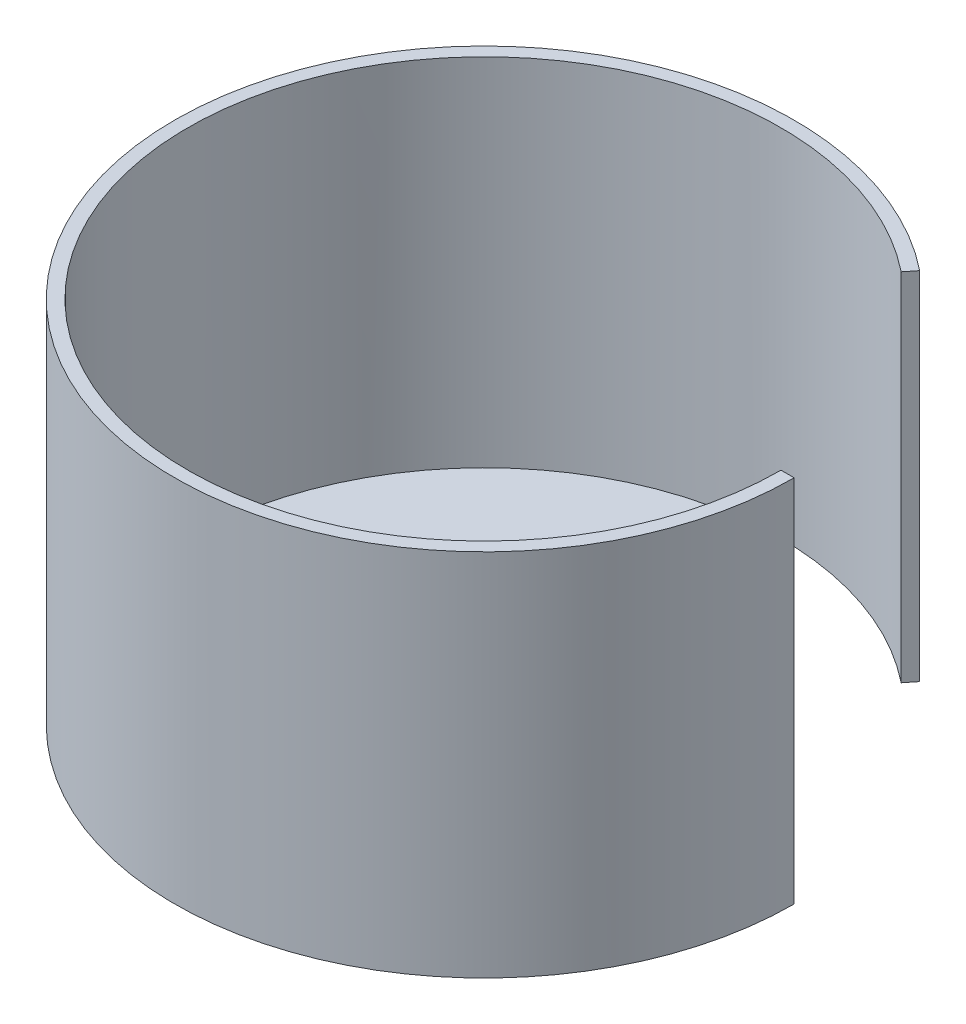
ISO-10303-21;
HEADER;
FILE_DESCRIPTION(('STEP AP214'),'2;1');
FILE_NAME('part.step','',(''),(''),'','','');
FILE_SCHEMA(('AUTOMOTIVE_DESIGN { 1 0 10303 214 1 1 1 1 }'));
ENDSEC;
DATA;
#1=APPLICATION_CONTEXT('core data for automotive mechanical design processes');
#2=APPLICATION_PROTOCOL_DEFINITION('international standard','automotive_design',2000,#1);
#3=PRODUCT_CONTEXT('',#1,'mechanical');
#4=PRODUCT('Part','Part','',(#3));
#5=PRODUCT_RELATED_PRODUCT_CATEGORY('part','',(#4));
#6=PRODUCT_DEFINITION_FORMATION('','',#4);
#7=PRODUCT_DEFINITION_CONTEXT('part definition',#1,'design');
#8=PRODUCT_DEFINITION('design','',#6,#7);
#9=PRODUCT_DEFINITION_SHAPE('','',#8);
#10=(LENGTH_UNIT() NAMED_UNIT(*) SI_UNIT(.MILLI.,.METRE.));
#11=(NAMED_UNIT(*) PLANE_ANGLE_UNIT() SI_UNIT($,.RADIAN.));
#12=(NAMED_UNIT(*) SI_UNIT($,.STERADIAN.) SOLID_ANGLE_UNIT());
#13=UNCERTAINTY_MEASURE_WITH_UNIT(LENGTH_MEASURE(1.E-05),#10,'distance_accuracy_value','');
#14=(GEOMETRIC_REPRESENTATION_CONTEXT(3) GLOBAL_UNCERTAINTY_ASSIGNED_CONTEXT((#13)) GLOBAL_UNIT_ASSIGNED_CONTEXT((#10,
#11,#12)) REPRESENTATION_CONTEXT('',''));
#15=CARTESIAN_POINT('',(0.,0.,0.));
#16=DIRECTION('',(0.,0.,1.));
#17=DIRECTION('',(1.,0.,0.));
#18=AXIS2_PLACEMENT_3D('',#15,#16,#17);
#19=CARTESIAN_POINT('',(0.,2.,0.));
#20=DIRECTION('',(0.,1.,0.));
#21=DIRECTION('',(0.,0.,1.));
#22=AXIS2_PLACEMENT_3D('',#19,#20,#21);
#23=PLANE('',#22);
#24=CARTESIAN_POINT('',(0.,2.,0.));
#25=DIRECTION('',(0.,-1.,0.));
#26=DIRECTION('',(0.,0.,1.));
#27=AXIS2_PLACEMENT_3D('',#24,#25,#26);
#28=CIRCLE('',#27,45.);
#29=CARTESIAN_POINT('',(42.6905850844787,2.,14.2307394447684));
#30=VERTEX_POINT('',#29);
#31=CARTESIAN_POINT('',(-10.0134420280343,2.,-43.871756048182));
#32=VERTEX_POINT('',#31);
#33=EDGE_CURVE('E163',#30,#32,#28,.T.);
#34=ORIENTED_EDGE('',*,*,#33,.F.);
#35=DIRECTION('',(-1.,0.,0.));
#36=VECTOR('',#35,1.);
#37=CARTESIAN_POINT('',(15.,2.,14.2307394447684));
#38=LINE('',#37,#36);
#39=CARTESIAN_POINT('',(4.74194631508132,2.,14.2307394447684));
#40=VERTEX_POINT('',#39);
#41=EDGE_CURVE('E150',#30,#40,#38,.T.);
#42=ORIENTED_EDGE('',*,*,#41,.T.);
#43=CARTESIAN_POINT('',(0.,2.,0.));
#44=DIRECTION('',(0.,1.,0.));
#45=DIRECTION('',(0.,0.,1.));
#46=AXIS2_PLACEMENT_3D('',#43,#44,#45);
#47=CIRCLE('',#46,15.);
#48=CARTESIAN_POINT('',(-3.33781400934477,2.,-14.6239186827273));
#49=VERTEX_POINT('',#48);
#50=EDGE_CURVE('E55',#40,#49,#47,.T.);
#51=ORIENTED_EDGE('',*,*,#50,.T.);
#52=DIRECTION('',(-0.222520933956318,0.,-0.974927912181823));
#53=VECTOR('',#52,1.);
#54=CARTESIAN_POINT('',(-3.33781400934477,2.,-14.6239186827273));
#55=LINE('',#54,#53);
#56=EDGE_CURVE('E132',#49,#32,#55,.T.);
#57=ORIENTED_EDGE('',*,*,#56,.T.);
#58=EDGE_LOOP('',(#34,#42,#51,#57));
#59=FACE_BOUND('',#58,.T.);
#60=ADVANCED_FACE('F33',(#59),#23,.T.);
#61=CARTESIAN_POINT('',(0.,2.,0.));
#62=DIRECTION('',(0.,-1.,0.));
#63=DIRECTION('',(0.,0.,-1.));
#64=AXIS2_PLACEMENT_3D('',#61,#62,#63);
#65=CYLINDRICAL_SURFACE('',#64,15.);
#66=CARTESIAN_POINT('',(0.,0.,0.));
#67=DIRECTION('',(0.,1.,0.));
#68=DIRECTION('',(0.,0.,1.));
#69=AXIS2_PLACEMENT_3D('',#66,#67,#68);
#70=CIRCLE('',#69,15.);
#71=CARTESIAN_POINT('',(15.,0.,0.));
#72=VERTEX_POINT('',#71);
#73=CARTESIAN_POINT('',(-3.33781400934477,0.,-14.6239186827273));
#74=VERTEX_POINT('',#73);
#75=EDGE_CURVE('E121',#72,#74,#70,.T.);
#76=ORIENTED_EDGE('',*,*,#75,.T.);
#77=DIRECTION('',(0.,-1.,0.));
#78=VECTOR('',#77,1.);
#79=CARTESIAN_POINT('',(-3.33781400934477,2.,-14.6239186827273));
#80=LINE('',#79,#78);
#81=EDGE_CURVE('E147',#49,#74,#80,.T.);
#82=ORIENTED_EDGE('',*,*,#81,.F.);
#83=ORIENTED_EDGE('',*,*,#50,.F.);
#84=CARTESIAN_POINT('',(0.,0.,0.));
#85=DIRECTION('',(0.,0.99026806874157,-0.139173100960066));
#86=DIRECTION('',(0.,-0.139173100960066,-0.99026806874157));
#87=AXIS2_PLACEMENT_3D('',#84,#85,#86);
#88=ELLIPSE('',#87,15.1474135877793,15.);
#89=EDGE_CURVE('E41',#40,#72,#88,.T.);
#90=ORIENTED_EDGE('',*,*,#89,.T.);
#91=EDGE_LOOP('',(#76,#82,#83,#90));
#92=FACE_BOUND('',#91,.T.);
#93=ADVANCED_FACE('F153',(#92),#65,.T.);
#94=CARTESIAN_POINT('',(-3.33781400934477,2.,-14.6239186827273));
#95=DIRECTION('',(-0.974927912181823,0.,0.222520933956318));
#96=DIRECTION('',(0.222520933956318,0.,0.974927912181823));
#97=AXIS2_PLACEMENT_3D('',#94,#95,#96);
#98=PLANE('',#97);
#99=DIRECTION('',(-0.222520933956318,0.,-0.974927912181823));
#100=VECTOR('',#99,1.);
#101=CARTESIAN_POINT('',(-3.33781400934477,0.,-14.6239186827273));
#102=LINE('',#101,#100);
#103=CARTESIAN_POINT('',(-10.458483895947,0.,-45.8216118725457));
#104=VERTEX_POINT('',#103);
#105=EDGE_CURVE('E124',#74,#104,#102,.T.);
#106=ORIENTED_EDGE('',*,*,#105,.T.);
#107=DIRECTION('',(0.,-1.,0.));
#108=VECTOR('',#107,1.);
#109=CARTESIAN_POINT('',(-10.458483895947,2.,-45.8216118725457));
#110=LINE('',#109,#108);
#111=CARTESIAN_POINT('',(-10.458483895947,2.,-45.8216118725457));
#112=VERTEX_POINT('',#111);
#113=EDGE_CURVE('E144',#112,#104,#110,.T.);
#114=ORIENTED_EDGE('',*,*,#113,.F.);
#115=EDGE_CURVE('E130',#32,#112,#55,.T.);
#116=ORIENTED_EDGE('',*,*,#115,.F.);
#117=ORIENTED_EDGE('',*,*,#56,.F.);
#118=ORIENTED_EDGE('',*,*,#81,.T.);
#119=EDGE_LOOP('',(#106,#114,#116,#117,#118));
#120=FACE_BOUND('',#119,.T.);
#121=ADVANCED_FACE('F180',(#120),#98,.F.);
#122=CARTESIAN_POINT('',(0.,2.,0.));
#123=DIRECTION('',(0.,-1.,0.));
#124=DIRECTION('',(0.,0.,-1.));
#125=AXIS2_PLACEMENT_3D('',#122,#123,#124);
#126=CYLINDRICAL_SURFACE('',#125,47.);
#127=CARTESIAN_POINT('',(0.,0.,0.));
#128=DIRECTION('',(0.,1.,0.));
#129=DIRECTION('',(0.,0.,1.));
#130=AXIS2_PLACEMENT_3D('',#127,#128,#129);
#131=CIRCLE('',#130,47.);
#132=CARTESIAN_POINT('',(47.,0.,0.));
#133=VERTEX_POINT('',#132);
#134=EDGE_CURVE('E137',#104,#133,#131,.T.);
#135=ORIENTED_EDGE('',*,*,#134,.T.);
#136=DIRECTION('',(0.,-1.,0.));
#137=VECTOR('',#136,1.);
#138=CARTESIAN_POINT('',(47.,2.,0.));
#139=LINE('',#138,#137);
#140=CARTESIAN_POINT('',(47.,56.,0.));
#141=VERTEX_POINT('',#140);
#142=EDGE_CURVE('E134',#141,#133,#139,.T.);
#143=ORIENTED_EDGE('',*,*,#142,.F.);
#144=CARTESIAN_POINT('',(0.,56.,0.));
#145=DIRECTION('',(0.,1.,0.));
#146=DIRECTION('',(0.,0.,1.));
#147=AXIS2_PLACEMENT_3D('',#144,#145,#146);
#148=CIRCLE('',#147,47.);
#149=CARTESIAN_POINT('',(29.3040206873604,56.,-36.7460796759974));
#150=VERTEX_POINT('',#149);
#151=EDGE_CURVE('E109',#150,#141,#148,.T.);
#152=ORIENTED_EDGE('',*,*,#151,.F.);
#153=DIRECTION('',(0.,-1.,0.));
#154=VECTOR('',#153,1.);
#155=CARTESIAN_POINT('',(29.3040206873604,56.,-36.7460796759974));
#156=LINE('',#155,#154);
#157=CARTESIAN_POINT('',(29.3040206873604,2.,-36.7460796759974));
#158=VERTEX_POINT('',#157);
#159=EDGE_CURVE('E105',#150,#158,#156,.T.);
#160=ORIENTED_EDGE('',*,*,#159,.T.);
#161=CARTESIAN_POINT('',(0.,2.,0.));
#162=DIRECTION('',(0.,1.,0.));
#163=DIRECTION('',(0.,0.,1.));
#164=AXIS2_PLACEMENT_3D('',#161,#162,#163);
#165=CIRCLE('',#164,47.);
#166=EDGE_CURVE('E115',#158,#112,#165,.T.);
#167=ORIENTED_EDGE('',*,*,#166,.T.);
#168=ORIENTED_EDGE('',*,*,#113,.T.);
#169=EDGE_LOOP('',(#135,#143,#152,#160,#167,#168));
#170=FACE_BOUND('',#169,.T.);
#171=ADVANCED_FACE('F176',(#170),#126,.T.);
#172=CARTESIAN_POINT('',(15.,2.,0.));
#173=DIRECTION('',(0.,0.,1.));
#174=DIRECTION('',(1.,0.,0.));
#175=AXIS2_PLACEMENT_3D('',#172,#173,#174);
#176=PLANE('',#175);
#177=DIRECTION('',(-1.,0.,0.));
#178=VECTOR('',#177,1.);
#179=CARTESIAN_POINT('',(15.,0.,0.));
#180=LINE('',#179,#178);
#181=CARTESIAN_POINT('',(45.,0.,0.));
#182=VERTEX_POINT('',#181);
#183=EDGE_CURVE('E131',#133,#182,#180,.T.);
#184=ORIENTED_EDGE('',*,*,#183,.T.);
#185=DIRECTION('',(0.,-1.,0.));
#186=VECTOR('',#185,1.);
#187=CARTESIAN_POINT('',(45.,56.,0.));
#188=LINE('',#187,#186);
#189=CARTESIAN_POINT('',(45.,56.,0.));
#190=VERTEX_POINT('',#189);
#191=EDGE_CURVE('E47',#190,#182,#188,.T.);
#192=ORIENTED_EDGE('',*,*,#191,.F.);
#193=DIRECTION('',(-1.,0.,0.));
#194=VECTOR('',#193,1.);
#195=CARTESIAN_POINT('',(45.,56.,0.));
#196=LINE('',#195,#194);
#197=EDGE_CURVE('E114',#141,#190,#196,.T.);
#198=ORIENTED_EDGE('',*,*,#197,.F.);
#199=ORIENTED_EDGE('',*,*,#142,.T.);
#200=EDGE_LOOP('',(#184,#192,#198,#199));
#201=FACE_BOUND('',#200,.T.);
#202=ADVANCED_FACE('F175',(#201),#176,.F.);
#203=CARTESIAN_POINT('',(0.,0.,0.));
#204=DIRECTION('',(0.,1.,0.));
#205=DIRECTION('',(0.,0.,1.));
#206=AXIS2_PLACEMENT_3D('',#203,#204,#205);
#207=PLANE('',#206);
#208=ORIENTED_EDGE('',*,*,#75,.F.);
#209=EDGE_CURVE('E139',#182,#72,#180,.T.);
#210=ORIENTED_EDGE('',*,*,#209,.F.);
#211=ORIENTED_EDGE('',*,*,#183,.F.);
#212=ORIENTED_EDGE('',*,*,#134,.F.);
#213=ORIENTED_EDGE('',*,*,#105,.F.);
#214=EDGE_LOOP('',(#208,#210,#211,#212,#213));
#215=FACE_BOUND('',#214,.T.);
#216=ADVANCED_FACE('F158',(#215),#207,.F.);
#217=CARTESIAN_POINT('',(0.,2.,0.));
#218=DIRECTION('',(0.,1.,0.));
#219=DIRECTION('',(0.,0.,1.));
#220=AXIS2_PLACEMENT_3D('',#217,#218,#219);
#221=PLANE('',#220);
#222=CARTESIAN_POINT('',(28.0570410836429,2.,-35.1824167110614));
#223=VERTEX_POINT('',#222);
#224=EDGE_CURVE('E119',#32,#223,#28,.T.);
#225=ORIENTED_EDGE('',*,*,#224,.F.);
#226=ORIENTED_EDGE('',*,*,#115,.T.);
#227=ORIENTED_EDGE('',*,*,#166,.F.);
#228=DIRECTION('',(0.623489801858732,0.,-0.781831482468031));
#229=VECTOR('',#228,1.);
#230=CARTESIAN_POINT('',(28.0570410836429,2.,-35.1824167110614));
#231=LINE('',#230,#229);
#232=EDGE_CURVE('E166',#223,#158,#231,.T.);
#233=ORIENTED_EDGE('',*,*,#232,.F.);
#234=EDGE_LOOP('',(#225,#226,#227,#233));
#235=FACE_BOUND('',#234,.T.);
#236=ADVANCED_FACE('F182',(#235),#221,.F.);
#237=CARTESIAN_POINT('',(0.,56.,0.));
#238=DIRECTION('',(0.,-1.,0.));
#239=DIRECTION('',(0.,0.,-1.));
#240=AXIS2_PLACEMENT_3D('',#237,#238,#239);
#241=CYLINDRICAL_SURFACE('',#240,45.);
#242=ORIENTED_EDGE('',*,*,#191,.T.);
#243=CARTESIAN_POINT('',(0.,0.,0.));
#244=DIRECTION('',(0.,0.99026806874157,-0.139173100960066));
#245=DIRECTION('',(0.,-0.139173100960066,-0.99026806874157));
#246=AXIS2_PLACEMENT_3D('',#243,#244,#245);
#247=ELLIPSE('',#246,45.4422407633378,45.);
#248=EDGE_CURVE('E11',#182,#30,#247,.F.);
#249=ORIENTED_EDGE('',*,*,#248,.T.);
#250=ORIENTED_EDGE('',*,*,#33,.T.);
#251=ORIENTED_EDGE('',*,*,#224,.T.);
#252=DIRECTION('',(0.,-1.,0.));
#253=VECTOR('',#252,1.);
#254=CARTESIAN_POINT('',(28.0570410836429,56.,-35.1824167110614));
#255=LINE('',#254,#253);
#256=CARTESIAN_POINT('',(28.0570410836429,56.,-35.1824167110614));
#257=VERTEX_POINT('',#256);
#258=EDGE_CURVE('E103',#257,#223,#255,.T.);
#259=ORIENTED_EDGE('',*,*,#258,.F.);
#260=CARTESIAN_POINT('',(0.,56.,0.));
#261=DIRECTION('',(0.,-1.,0.));
#262=DIRECTION('',(0.,0.,1.));
#263=AXIS2_PLACEMENT_3D('',#260,#261,#262);
#264=CIRCLE('',#263,45.);
#265=EDGE_CURVE('E110',#190,#257,#264,.T.);
#266=ORIENTED_EDGE('',*,*,#265,.F.);
#267=EDGE_LOOP('',(#242,#249,#250,#251,#259,#266));
#268=FACE_BOUND('',#267,.T.);
#269=ADVANCED_FACE('F117',(#268),#241,.F.);
#270=CARTESIAN_POINT('',(28.0570410836429,56.,-35.1824167110614));
#271=DIRECTION('',(-0.781831482468031,0.,-0.623489801858732));
#272=DIRECTION('',(-0.623489801858732,0.,0.781831482468031));
#273=AXIS2_PLACEMENT_3D('',#270,#271,#272);
#274=PLANE('',#273);
#275=ORIENTED_EDGE('',*,*,#232,.T.);
#276=ORIENTED_EDGE('',*,*,#159,.F.);
#277=DIRECTION('',(0.623489801858732,0.,-0.781831482468031));
#278=VECTOR('',#277,1.);
#279=CARTESIAN_POINT('',(28.0570410836429,56.,-35.1824167110614));
#280=LINE('',#279,#278);
#281=EDGE_CURVE('E99',#257,#150,#280,.T.);
#282=ORIENTED_EDGE('',*,*,#281,.F.);
#283=ORIENTED_EDGE('',*,*,#258,.T.);
#284=EDGE_LOOP('',(#275,#276,#282,#283));
#285=FACE_BOUND('',#284,.T.);
#286=ADVANCED_FACE('F101',(#285),#274,.F.);
#287=CARTESIAN_POINT('',(0.,56.,0.));
#288=DIRECTION('',(0.,1.,0.));
#289=DIRECTION('',(0.,0.,1.));
#290=AXIS2_PLACEMENT_3D('',#287,#288,#289);
#291=PLANE('',#290);
#292=ORIENTED_EDGE('',*,*,#265,.T.);
#293=ORIENTED_EDGE('',*,*,#281,.T.);
#294=ORIENTED_EDGE('',*,*,#151,.T.);
#295=ORIENTED_EDGE('',*,*,#197,.T.);
#296=EDGE_LOOP('',(#292,#293,#294,#295));
#297=FACE_BOUND('',#296,.T.);
#298=ADVANCED_FACE('F112',(#297),#291,.T.);
#299=CARTESIAN_POINT('',(0.,2.,14.2307394447684));
#300=DIRECTION('',(0.,0.99026806874157,-0.139173100960066));
#301=DIRECTION('',(1.,0.,0.));
#302=AXIS2_PLACEMENT_3D('',#299,#300,#301);
#303=PLANE('',#302);
#304=ORIENTED_EDGE('',*,*,#248,.F.);
#305=ORIENTED_EDGE('',*,*,#209,.T.);
#306=ORIENTED_EDGE('',*,*,#89,.F.);
#307=ORIENTED_EDGE('',*,*,#41,.F.);
#308=EDGE_LOOP('',(#304,#305,#306,#307));
#309=FACE_BOUND('',#308,.T.);
#310=ADVANCED_FACE('F35',(#309),#303,.T.);
#311=CLOSED_SHELL('',(#60,#93,#121,#171,#202,#216,#236,#269,#286,#298,#310));
#312=MANIFOLD_SOLID_BREP('B2',#311);
#313=ADVANCED_BREP_SHAPE_REPRESENTATION('',(#18,#312),#14);
#314=SHAPE_DEFINITION_REPRESENTATION(#9,#313);
ENDSEC;
END-ISO-10303-21;
